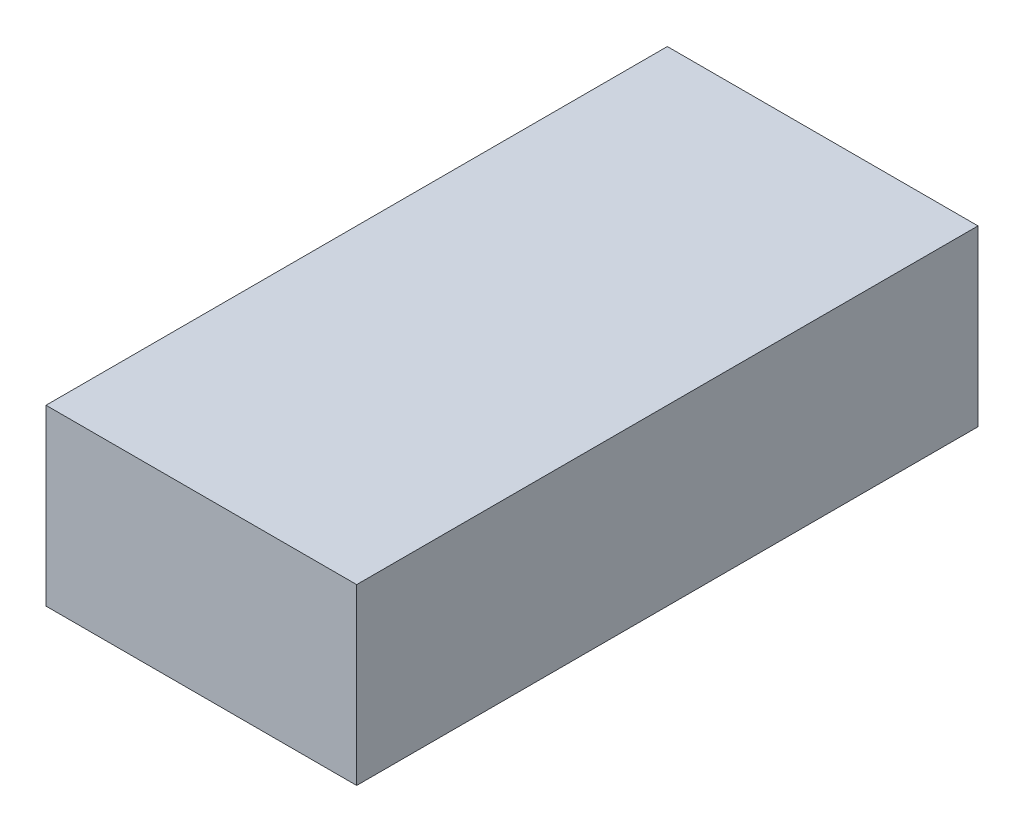
ISO-10303-21;
HEADER;
FILE_DESCRIPTION(('STEP AP214'),'2;1');
FILE_NAME('part.step','',(''),(''),'','','');
FILE_SCHEMA(('AUTOMOTIVE_DESIGN { 1 0 10303 214 1 1 1 1 }'));
ENDSEC;
DATA;
#1=APPLICATION_CONTEXT('core data for automotive mechanical design processes');
#2=APPLICATION_PROTOCOL_DEFINITION('international standard','automotive_design',2000,#1);
#3=PRODUCT_CONTEXT('',#1,'mechanical');
#4=PRODUCT('Part','Part','',(#3));
#5=PRODUCT_RELATED_PRODUCT_CATEGORY('part','',(#4));
#6=PRODUCT_DEFINITION_FORMATION('','',#4);
#7=PRODUCT_DEFINITION_CONTEXT('part definition',#1,'design');
#8=PRODUCT_DEFINITION('design','',#6,#7);
#9=PRODUCT_DEFINITION_SHAPE('','',#8);
#10=(LENGTH_UNIT() NAMED_UNIT(*) SI_UNIT(.MILLI.,.METRE.));
#11=(NAMED_UNIT(*) PLANE_ANGLE_UNIT() SI_UNIT($,.RADIAN.));
#12=(NAMED_UNIT(*) SI_UNIT($,.STERADIAN.) SOLID_ANGLE_UNIT());
#13=UNCERTAINTY_MEASURE_WITH_UNIT(LENGTH_MEASURE(1.E-05),#10,'distance_accuracy_value','');
#14=(GEOMETRIC_REPRESENTATION_CONTEXT(3) GLOBAL_UNCERTAINTY_ASSIGNED_CONTEXT((#13)) GLOBAL_UNIT_ASSIGNED_CONTEXT((#10,
#11,#12)) REPRESENTATION_CONTEXT('',''));
#15=CARTESIAN_POINT('',(0.,0.,0.));
#16=DIRECTION('',(0.,0.,1.));
#17=DIRECTION('',(1.,0.,0.));
#18=AXIS2_PLACEMENT_3D('',#15,#16,#17);
#19=CARTESIAN_POINT('',(25.,-14.,-100.));
#20=DIRECTION('',(1.,0.,0.));
#21=DIRECTION('',(0.,0.,-1.));
#22=AXIS2_PLACEMENT_3D('',#19,#20,#21);
#23=PLANE('',#22);
#24=DIRECTION('',(0.,1.,0.));
#25=VECTOR('',#24,1.);
#26=CARTESIAN_POINT('',(25.,-14.,0.));
#27=LINE('',#26,#25);
#28=CARTESIAN_POINT('',(25.,-14.,0.));
#29=VERTEX_POINT('',#28);
#30=CARTESIAN_POINT('',(25.,14.,0.));
#31=VERTEX_POINT('',#30);
#32=EDGE_CURVE('E103',#29,#31,#27,.T.);
#33=ORIENTED_EDGE('',*,*,#32,.F.);
#34=DIRECTION('',(0.,0.,1.));
#35=VECTOR('',#34,1.);
#36=CARTESIAN_POINT('',(25.,-14.,-100.));
#37=LINE('',#36,#35);
#38=CARTESIAN_POINT('',(25.,-14.,-100.));
#39=VERTEX_POINT('',#38);
#40=EDGE_CURVE('E11',#39,#29,#37,.T.);
#41=ORIENTED_EDGE('',*,*,#40,.F.);
#42=DIRECTION('',(0.,1.,0.));
#43=VECTOR('',#42,1.);
#44=CARTESIAN_POINT('',(25.,-14.,-100.));
#45=LINE('',#44,#43);
#46=CARTESIAN_POINT('',(25.,14.,-100.));
#47=VERTEX_POINT('',#46);
#48=EDGE_CURVE('E97',#39,#47,#45,.T.);
#49=ORIENTED_EDGE('',*,*,#48,.T.);
#50=DIRECTION('',(0.,0.,1.));
#51=VECTOR('',#50,1.);
#52=CARTESIAN_POINT('',(25.,14.,-100.));
#53=LINE('',#52,#51);
#54=EDGE_CURVE('E42',#47,#31,#53,.T.);
#55=ORIENTED_EDGE('',*,*,#54,.T.);
#56=EDGE_LOOP('',(#33,#41,#49,#55));
#57=FACE_BOUND('',#56,.T.);
#58=ADVANCED_FACE('F39',(#57),#23,.T.);
#59=CARTESIAN_POINT('',(-25.,-14.,-100.));
#60=DIRECTION('',(0.,-1.,0.));
#61=DIRECTION('',(0.,0.,-1.));
#62=AXIS2_PLACEMENT_3D('',#59,#60,#61);
#63=PLANE('',#62);
#64=DIRECTION('',(1.,0.,0.));
#65=VECTOR('',#64,1.);
#66=CARTESIAN_POINT('',(-25.,-14.,0.));
#67=LINE('',#66,#65);
#68=CARTESIAN_POINT('',(-25.,-14.,0.));
#69=VERTEX_POINT('',#68);
#70=EDGE_CURVE('E99',#69,#29,#67,.T.);
#71=ORIENTED_EDGE('',*,*,#70,.F.);
#72=DIRECTION('',(0.,0.,1.));
#73=VECTOR('',#72,1.);
#74=CARTESIAN_POINT('',(-25.,-14.,-100.));
#75=LINE('',#74,#73);
#76=CARTESIAN_POINT('',(-25.,-14.,-100.));
#77=VERTEX_POINT('',#76);
#78=EDGE_CURVE('E48',#77,#69,#75,.T.);
#79=ORIENTED_EDGE('',*,*,#78,.F.);
#80=DIRECTION('',(1.,0.,0.));
#81=VECTOR('',#80,1.);
#82=CARTESIAN_POINT('',(-25.,-14.,-100.));
#83=LINE('',#82,#81);
#84=EDGE_CURVE('E94',#77,#39,#83,.T.);
#85=ORIENTED_EDGE('',*,*,#84,.T.);
#86=ORIENTED_EDGE('',*,*,#40,.T.);
#87=EDGE_LOOP('',(#71,#79,#85,#86));
#88=FACE_BOUND('',#87,.T.);
#89=ADVANCED_FACE('F113',(#88),#63,.T.);
#90=CARTESIAN_POINT('',(-25.,-14.,-100.));
#91=DIRECTION('',(-1.,0.,0.));
#92=DIRECTION('',(0.,0.,1.));
#93=AXIS2_PLACEMENT_3D('',#90,#91,#92);
#94=PLANE('',#93);
#95=DIRECTION('',(0.,-1.,0.));
#96=VECTOR('',#95,1.);
#97=CARTESIAN_POINT('',(-25.,-14.,0.));
#98=LINE('',#97,#96);
#99=CARTESIAN_POINT('',(-25.,14.,0.));
#100=VERTEX_POINT('',#99);
#101=EDGE_CURVE('E89',#100,#69,#98,.T.);
#102=ORIENTED_EDGE('',*,*,#101,.F.);
#103=DIRECTION('',(0.,0.,1.));
#104=VECTOR('',#103,1.);
#105=CARTESIAN_POINT('',(-25.,14.,-100.));
#106=LINE('',#105,#104);
#107=CARTESIAN_POINT('',(-25.,14.,-100.));
#108=VERTEX_POINT('',#107);
#109=EDGE_CURVE('E84',#108,#100,#106,.T.);
#110=ORIENTED_EDGE('',*,*,#109,.F.);
#111=DIRECTION('',(0.,-1.,0.));
#112=VECTOR('',#111,1.);
#113=CARTESIAN_POINT('',(-25.,-14.,-100.));
#114=LINE('',#113,#112);
#115=EDGE_CURVE('E87',#108,#77,#114,.T.);
#116=ORIENTED_EDGE('',*,*,#115,.T.);
#117=ORIENTED_EDGE('',*,*,#78,.T.);
#118=EDGE_LOOP('',(#102,#110,#116,#117));
#119=FACE_BOUND('',#118,.T.);
#120=ADVANCED_FACE('F86',(#119),#94,.T.);
#121=CARTESIAN_POINT('',(-25.,14.,-100.));
#122=DIRECTION('',(0.,1.,0.));
#123=DIRECTION('',(0.,0.,1.));
#124=AXIS2_PLACEMENT_3D('',#121,#122,#123);
#125=PLANE('',#124);
#126=DIRECTION('',(-1.,0.,0.));
#127=VECTOR('',#126,1.);
#128=CARTESIAN_POINT('',(-25.,14.,0.));
#129=LINE('',#128,#127);
#130=EDGE_CURVE('E106',#31,#100,#129,.T.);
#131=ORIENTED_EDGE('',*,*,#130,.F.);
#132=ORIENTED_EDGE('',*,*,#54,.F.);
#133=DIRECTION('',(-1.,0.,0.));
#134=VECTOR('',#133,1.);
#135=CARTESIAN_POINT('',(-25.,14.,-100.));
#136=LINE('',#135,#134);
#137=EDGE_CURVE('E93',#47,#108,#136,.T.);
#138=ORIENTED_EDGE('',*,*,#137,.T.);
#139=ORIENTED_EDGE('',*,*,#109,.T.);
#140=EDGE_LOOP('',(#131,#132,#138,#139));
#141=FACE_BOUND('',#140,.T.);
#142=ADVANCED_FACE('F96',(#141),#125,.T.);
#143=CARTESIAN_POINT('',(0.,0.,-100.));
#144=DIRECTION('',(0.,0.,-1.));
#145=DIRECTION('',(-1.,0.,0.));
#146=AXIS2_PLACEMENT_3D('',#143,#144,#145);
#147=PLANE('',#146);
#148=ORIENTED_EDGE('',*,*,#48,.F.);
#149=ORIENTED_EDGE('',*,*,#84,.F.);
#150=ORIENTED_EDGE('',*,*,#115,.F.);
#151=ORIENTED_EDGE('',*,*,#137,.F.);
#152=EDGE_LOOP('',(#148,#149,#150,#151));
#153=FACE_BOUND('',#152,.T.);
#154=ADVANCED_FACE('F92',(#153),#147,.T.);
#155=CARTESIAN_POINT('',(0.,0.,0.));
#156=DIRECTION('',(0.,0.,-1.));
#157=DIRECTION('',(-1.,0.,0.));
#158=AXIS2_PLACEMENT_3D('',#155,#156,#157);
#159=PLANE('',#158);
#160=ORIENTED_EDGE('',*,*,#32,.T.);
#161=ORIENTED_EDGE('',*,*,#130,.T.);
#162=ORIENTED_EDGE('',*,*,#101,.T.);
#163=ORIENTED_EDGE('',*,*,#70,.T.);
#164=EDGE_LOOP('',(#160,#161,#162,#163));
#165=FACE_BOUND('',#164,.T.);
#166=ADVANCED_FACE('F112',(#165),#159,.F.);
#167=CLOSED_SHELL('',(#58,#89,#120,#142,#154,#166));
#168=MANIFOLD_SOLID_BREP('B2',#167);
#169=ADVANCED_BREP_SHAPE_REPRESENTATION('',(#18,#168),#14);
#170=SHAPE_DEFINITION_REPRESENTATION(#9,#169);
ENDSEC;
END-ISO-10303-21;
